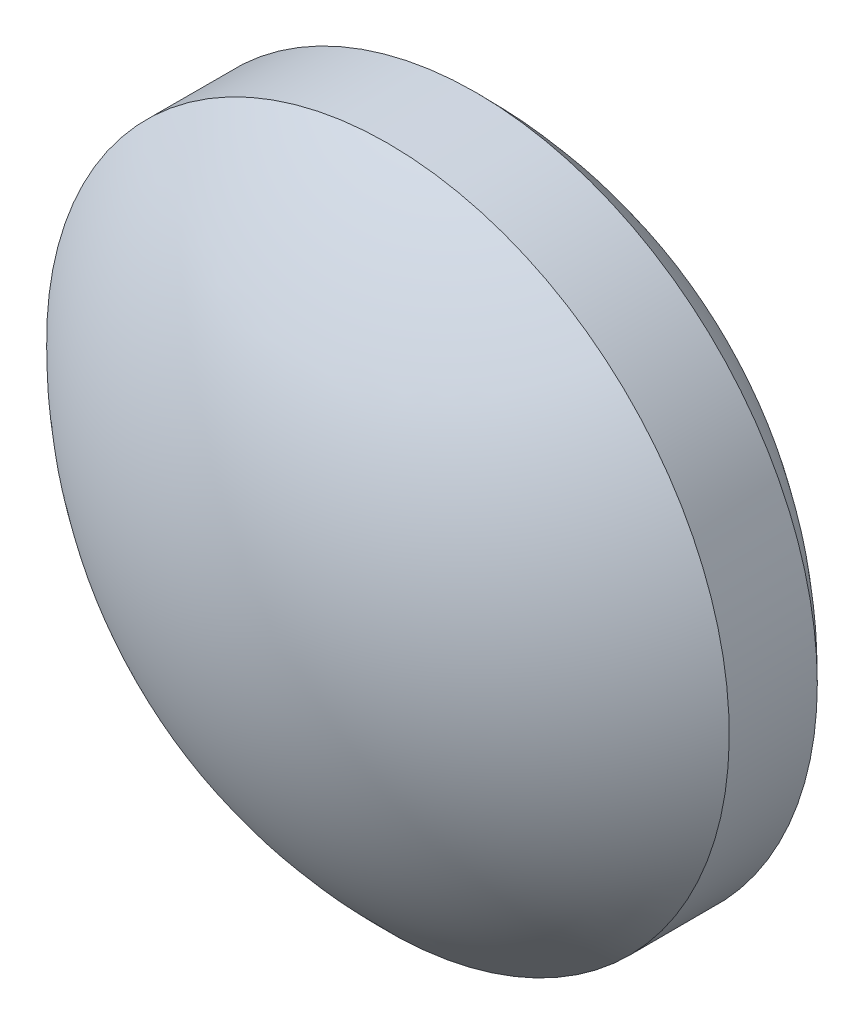
ISO-10303-21;
HEADER;
FILE_DESCRIPTION(('STEP AP214'),'2;1');
FILE_NAME('part.step','',(''),(''),'','','');
FILE_SCHEMA(('AUTOMOTIVE_DESIGN { 1 0 10303 214 1 1 1 1 }'));
ENDSEC;
DATA;
#1=APPLICATION_CONTEXT('core data for automotive mechanical design processes');
#2=APPLICATION_PROTOCOL_DEFINITION('international standard','automotive_design',2000,#1);
#3=PRODUCT_CONTEXT('',#1,'mechanical');
#4=PRODUCT('Part','Part','',(#3));
#5=PRODUCT_RELATED_PRODUCT_CATEGORY('part','',(#4));
#6=PRODUCT_DEFINITION_FORMATION('','',#4);
#7=PRODUCT_DEFINITION_CONTEXT('part definition',#1,'design');
#8=PRODUCT_DEFINITION('design','',#6,#7);
#9=PRODUCT_DEFINITION_SHAPE('','',#8);
#10=(LENGTH_UNIT() NAMED_UNIT(*) SI_UNIT(.MILLI.,.METRE.));
#11=(NAMED_UNIT(*) PLANE_ANGLE_UNIT() SI_UNIT($,.RADIAN.));
#12=(NAMED_UNIT(*) SI_UNIT($,.STERADIAN.) SOLID_ANGLE_UNIT());
#13=UNCERTAINTY_MEASURE_WITH_UNIT(LENGTH_MEASURE(1.E-05),#10,'distance_accuracy_value','');
#14=(GEOMETRIC_REPRESENTATION_CONTEXT(3) GLOBAL_UNCERTAINTY_ASSIGNED_CONTEXT((#13)) GLOBAL_UNIT_ASSIGNED_CONTEXT((#10,
#11,#12)) REPRESENTATION_CONTEXT('',''));
#15=CARTESIAN_POINT('',(0.,0.,0.));
#16=DIRECTION('',(0.,0.,1.));
#17=DIRECTION('',(1.,0.,0.));
#18=AXIS2_PLACEMENT_3D('',#15,#16,#17);
#19=CARTESIAN_POINT('',(0.,0.,3.26090082294123));
#20=DIRECTION('',(0.,0.,-1.));
#21=DIRECTION('',(0.,-1.,0.));
#22=AXIS2_PLACEMENT_3D('',#19,#20,#21);
#23=SPHERICAL_SURFACE('',#22,5.4);
#24=CARTESIAN_POINT('',(0.,0.,-0.5));
#25=DIRECTION('',(0.,0.,-1.));
#26=DIRECTION('',(0.,1.,0.));
#27=AXIS2_PLACEMENT_3D('',#24,#25,#26);
#28=CIRCLE('',#27,3.875);
#29=CARTESIAN_POINT('',(0.,3.875,-0.5));
#30=VERTEX_POINT('',#29);
#31=EDGE_CURVE('E10',#30,#30,#28,.T.);
#32=ORIENTED_EDGE('',*,*,#31,.T.);
#33=EDGE_LOOP('',(#32));
#34=FACE_BOUND('',#33,.T.);
#35=ADVANCED_FACE('F43',(#34),#23,.T.);
#36=CARTESIAN_POINT('',(0.,0.,0.));
#37=DIRECTION('',(0.,0.,-1.));
#38=DIRECTION('',(0.,1.,0.));
#39=AXIS2_PLACEMENT_3D('',#36,#37,#38);
#40=CYLINDRICAL_SURFACE('',#39,3.875);
#41=ORIENTED_EDGE('',*,*,#31,.F.);
#42=EDGE_LOOP('',(#41));
#43=FACE_BOUND('',#42,.T.);
#44=CARTESIAN_POINT('',(0.,0.,0.5));
#45=DIRECTION('',(0.,0.,-1.));
#46=DIRECTION('',(0.,1.,0.));
#47=AXIS2_PLACEMENT_3D('',#44,#45,#46);
#48=CIRCLE('',#47,3.875);
#49=CARTESIAN_POINT('',(0.,3.875,0.5));
#50=VERTEX_POINT('',#49);
#51=EDGE_CURVE('E50',#50,#50,#48,.T.);
#52=ORIENTED_EDGE('',*,*,#51,.T.);
#53=EDGE_LOOP('',(#52));
#54=FACE_BOUND('',#53,.T.);
#55=ADVANCED_FACE('F57',(#43,#54),#40,.T.);
#56=CARTESIAN_POINT('',(0.,0.,-3.26090082294123));
#57=DIRECTION('',(0.,0.,-1.));
#58=DIRECTION('',(0.,1.,0.));
#59=AXIS2_PLACEMENT_3D('',#56,#57,#58);
#60=SPHERICAL_SURFACE('',#59,5.4);
#61=ORIENTED_EDGE('',*,*,#51,.F.);
#62=EDGE_LOOP('',(#61));
#63=FACE_BOUND('',#62,.T.);
#64=ADVANCED_FACE('F59',(#63),#60,.T.);
#65=CLOSED_SHELL('',(#35,#55,#64));
#66=MANIFOLD_SOLID_BREP('B2',#65);
#67=ADVANCED_BREP_SHAPE_REPRESENTATION('',(#18,#66),#14);
#68=SHAPE_DEFINITION_REPRESENTATION(#9,#67);
ENDSEC;
END-ISO-10303-21;
